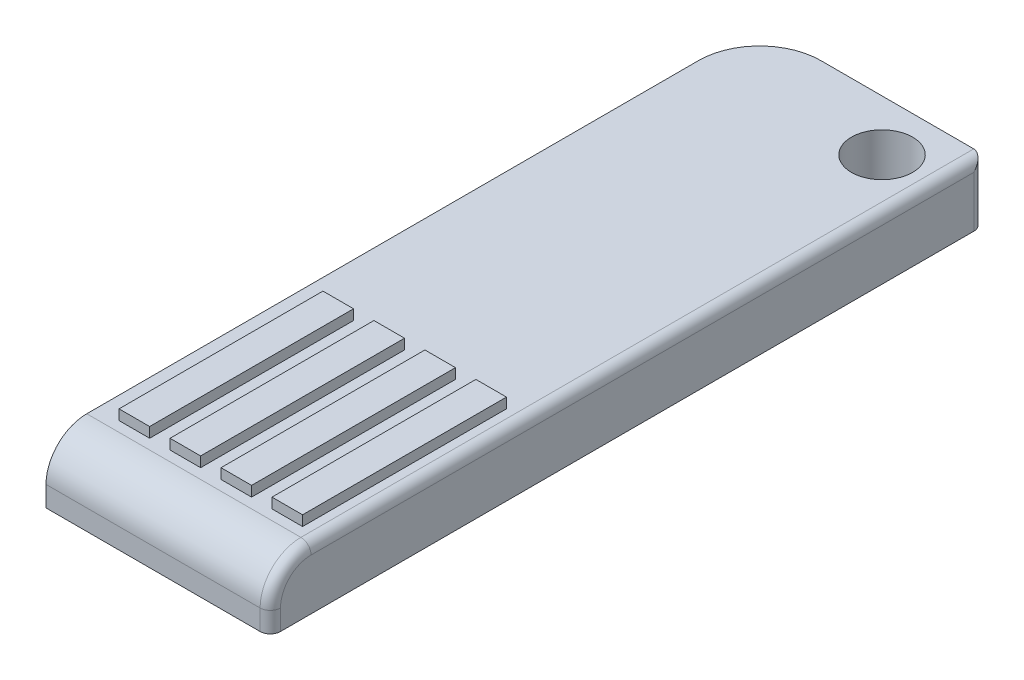
ISO-10303-21;
HEADER;
FILE_DESCRIPTION(('STEP AP214'),'2;1');
FILE_NAME('part.step','',(''),(''),'','','');
FILE_SCHEMA(('AUTOMOTIVE_DESIGN { 1 0 10303 214 1 1 1 1 }'));
ENDSEC;
DATA;
#1=APPLICATION_CONTEXT('core data for automotive mechanical design processes');
#2=APPLICATION_PROTOCOL_DEFINITION('international standard','automotive_design',2000,#1);
#3=PRODUCT_CONTEXT('',#1,'mechanical');
#4=PRODUCT('Part','Part','',(#3));
#5=PRODUCT_RELATED_PRODUCT_CATEGORY('part','',(#4));
#6=PRODUCT_DEFINITION_FORMATION('','',#4);
#7=PRODUCT_DEFINITION_CONTEXT('part definition',#1,'design');
#8=PRODUCT_DEFINITION('design','',#6,#7);
#9=PRODUCT_DEFINITION_SHAPE('','',#8);
#10=(LENGTH_UNIT() NAMED_UNIT(*) SI_UNIT(.MILLI.,.METRE.));
#11=(NAMED_UNIT(*) PLANE_ANGLE_UNIT() SI_UNIT($,.RADIAN.));
#12=(NAMED_UNIT(*) SI_UNIT($,.STERADIAN.) SOLID_ANGLE_UNIT());
#13=UNCERTAINTY_MEASURE_WITH_UNIT(LENGTH_MEASURE(1.E-05),#10,'distance_accuracy_value','');
#14=(GEOMETRIC_REPRESENTATION_CONTEXT(3) GLOBAL_UNCERTAINTY_ASSIGNED_CONTEXT((#13)) GLOBAL_UNIT_ASSIGNED_CONTEXT((#10,
#11,#12)) REPRESENTATION_CONTEXT('',''));
#15=CARTESIAN_POINT('',(0.,0.,0.));
#16=DIRECTION('',(0.,0.,1.));
#17=DIRECTION('',(1.,0.,0.));
#18=AXIS2_PLACEMENT_3D('',#15,#16,#17);
#19=CARTESIAN_POINT('',(0.,3.,0.));
#20=DIRECTION('',(0.,1.,0.));
#21=DIRECTION('',(0.,0.,1.));
#22=AXIS2_PLACEMENT_3D('',#19,#20,#21);
#23=PLANE('',#22);
#24=CARTESIAN_POINT('',(3.0000000000003,3.,-15.0000000000003));
#25=DIRECTION('',(0.,1.,0.));
#26=DIRECTION('',(0.,0.,1.));
#27=AXIS2_PLACEMENT_3D('',#24,#25,#26);
#28=CIRCLE('',#27,1.5);
#29=CARTESIAN_POINT('',(3.0000000000003,3.,-13.5000000000003));
#30=VERTEX_POINT('',#29);
#31=EDGE_CURVE('E318',#30,#30,#28,.T.);
#32=ORIENTED_EDGE('',*,*,#31,.F.);
#33=EDGE_LOOP('',(#32));
#34=FACE_BOUND('',#33,.T.);
#35=DIRECTION('',(1.,0.,0.));
#36=VECTOR('',#35,1.);
#37=CARTESIAN_POINT('',(5.5,3.,15.5));
#38=LINE('',#37,#36);
#39=CARTESIAN_POINT('',(-5.5,3.,15.5));
#40=VERTEX_POINT('',#39);
#41=CARTESIAN_POINT('',(5.,3.,15.5));
#42=VERTEX_POINT('',#41);
#43=EDGE_CURVE('E352',#40,#42,#38,.T.);
#44=ORIENTED_EDGE('',*,*,#43,.T.);
#45=DIRECTION('',(0.,0.,-1.));
#46=VECTOR('',#45,1.);
#47=CARTESIAN_POINT('',(4.99999999999999,3.,-17.5));
#48=LINE('',#47,#46);
#49=CARTESIAN_POINT('',(4.99999999999999,3.,-17.5));
#50=VERTEX_POINT('',#49);
#51=EDGE_CURVE('E359',#42,#50,#48,.T.);
#52=ORIENTED_EDGE('',*,*,#51,.T.);
#53=DIRECTION('',(-1.,0.,0.));
#54=VECTOR('',#53,1.);
#55=CARTESIAN_POINT('',(-5.50000000000001,3.,-17.5));
#56=LINE('',#55,#54);
#57=CARTESIAN_POINT('',(-2.50000000000001,3.,-17.5));
#58=VERTEX_POINT('',#57);
#59=EDGE_CURVE('E325',#50,#58,#56,.T.);
#60=ORIENTED_EDGE('',*,*,#59,.T.);
#61=CARTESIAN_POINT('',(-2.50000000000001,3.,-14.5));
#62=DIRECTION('',(0.,1.,0.));
#63=DIRECTION('',(0.,0.,1.));
#64=AXIS2_PLACEMENT_3D('',#61,#62,#63);
#65=CIRCLE('',#64,3.);
#66=CARTESIAN_POINT('',(-5.50000000000001,3.,-14.5));
#67=VERTEX_POINT('',#66);
#68=EDGE_CURVE('E350',#58,#67,#65,.T.);
#69=ORIENTED_EDGE('',*,*,#68,.T.);
#70=DIRECTION('',(0.,0.,1.));
#71=VECTOR('',#70,1.);
#72=CARTESIAN_POINT('',(-5.50000000000001,3.,-17.5));
#73=LINE('',#72,#71);
#74=EDGE_CURVE('E327',#67,#40,#73,.T.);
#75=ORIENTED_EDGE('',*,*,#74,.T.);
#76=EDGE_LOOP('',(#44,#52,#60,#69,#75));
#77=FACE_BOUND('',#76,.T.);
#78=DIRECTION('',(-1.,0.,0.));
#79=VECTOR('',#78,1.);
#80=CARTESIAN_POINT('',(-4.41748166259169,3.,5.00000000000002));
#81=LINE('',#80,#79);
#82=CARTESIAN_POINT('',(-2.91748166259169,3.,5.00000000000002));
#83=VERTEX_POINT('',#82);
#84=CARTESIAN_POINT('',(-4.41748166259169,3.,5.00000000000002));
#85=VERTEX_POINT('',#84);
#86=EDGE_CURVE('E303',#83,#85,#81,.T.);
#87=ORIENTED_EDGE('',*,*,#86,.F.);
#88=DIRECTION('',(0.,0.,-1.));
#89=VECTOR('',#88,1.);
#90=CARTESIAN_POINT('',(-2.91748166259169,3.,5.00000000000002));
#91=LINE('',#90,#89);
#92=CARTESIAN_POINT('',(-2.91748166259169,3.,15.));
#93=VERTEX_POINT('',#92);
#94=EDGE_CURVE('E289',#93,#83,#91,.T.);
#95=ORIENTED_EDGE('',*,*,#94,.F.);
#96=DIRECTION('',(1.,0.,0.));
#97=VECTOR('',#96,1.);
#98=CARTESIAN_POINT('',(-4.41748166259169,3.,15.));
#99=LINE('',#98,#97);
#100=CARTESIAN_POINT('',(-4.41748166259169,3.,15.));
#101=VERTEX_POINT('',#100);
#102=EDGE_CURVE('E294',#101,#93,#99,.T.);
#103=ORIENTED_EDGE('',*,*,#102,.F.);
#104=DIRECTION('',(0.,0.,1.));
#105=VECTOR('',#104,1.);
#106=CARTESIAN_POINT('',(-4.41748166259169,3.,5.00000000000002));
#107=LINE('',#106,#105);
#108=EDGE_CURVE('E305',#85,#101,#107,.T.);
#109=ORIENTED_EDGE('',*,*,#108,.F.);
#110=EDGE_LOOP('',(#87,#95,#103,#109));
#111=FACE_BOUND('',#110,.T.);
#112=DIRECTION('',(0.,0.,-1.));
#113=VECTOR('',#112,1.);
#114=CARTESIAN_POINT('',(-0.417481662591691,3.,5.00000000000002));
#115=LINE('',#114,#113);
#116=CARTESIAN_POINT('',(-0.41748166259169,3.,15.));
#117=VERTEX_POINT('',#116);
#118=CARTESIAN_POINT('',(-0.417481662591691,3.,5.00000000000002));
#119=VERTEX_POINT('',#118);
#120=EDGE_CURVE('E274',#117,#119,#115,.T.);
#121=ORIENTED_EDGE('',*,*,#120,.F.);
#122=DIRECTION('',(1.,0.,0.));
#123=VECTOR('',#122,1.);
#124=CARTESIAN_POINT('',(-1.91748166259169,3.,15.));
#125=LINE('',#124,#123);
#126=CARTESIAN_POINT('',(-1.91748166259169,3.,15.));
#127=VERTEX_POINT('',#126);
#128=EDGE_CURVE('E260',#127,#117,#125,.T.);
#129=ORIENTED_EDGE('',*,*,#128,.F.);
#130=DIRECTION('',(0.,0.,1.));
#131=VECTOR('',#130,1.);
#132=CARTESIAN_POINT('',(-1.91748166259169,3.,5.00000000000002));
#133=LINE('',#132,#131);
#134=CARTESIAN_POINT('',(-1.91748166259169,3.,5.00000000000002));
#135=VERTEX_POINT('',#134);
#136=EDGE_CURVE('E265',#135,#127,#133,.T.);
#137=ORIENTED_EDGE('',*,*,#136,.F.);
#138=DIRECTION('',(-1.,0.,0.));
#139=VECTOR('',#138,1.);
#140=CARTESIAN_POINT('',(-1.91748166259169,3.,5.00000000000002));
#141=LINE('',#140,#139);
#142=EDGE_CURVE('E276',#119,#135,#141,.T.);
#143=ORIENTED_EDGE('',*,*,#142,.F.);
#144=EDGE_LOOP('',(#121,#129,#137,#143));
#145=FACE_BOUND('',#144,.T.);
#146=DIRECTION('',(0.,0.,-1.));
#147=VECTOR('',#146,1.);
#148=CARTESIAN_POINT('',(2.08251833740831,3.,5.00000000000002));
#149=LINE('',#148,#147);
#150=CARTESIAN_POINT('',(2.08251833740831,3.,15.));
#151=VERTEX_POINT('',#150);
#152=CARTESIAN_POINT('',(2.08251833740831,3.,5.00000000000002));
#153=VERTEX_POINT('',#152);
#154=EDGE_CURVE('E229',#151,#153,#149,.T.);
#155=ORIENTED_EDGE('',*,*,#154,.F.);
#156=DIRECTION('',(1.,0.,0.));
#157=VECTOR('',#156,1.);
#158=CARTESIAN_POINT('',(0.582518337408309,3.,15.));
#159=LINE('',#158,#157);
#160=CARTESIAN_POINT('',(0.582518337408309,3.,15.));
#161=VERTEX_POINT('',#160);
#162=EDGE_CURVE('E226',#161,#151,#159,.T.);
#163=ORIENTED_EDGE('',*,*,#162,.F.);
#164=DIRECTION('',(0.,0.,1.));
#165=VECTOR('',#164,1.);
#166=CARTESIAN_POINT('',(0.582518337408308,3.,5.00000000000002));
#167=LINE('',#166,#165);
#168=CARTESIAN_POINT('',(0.582518337408308,3.,5.00000000000002));
#169=VERTEX_POINT('',#168);
#170=EDGE_CURVE('E239',#169,#161,#167,.T.);
#171=ORIENTED_EDGE('',*,*,#170,.F.);
#172=DIRECTION('',(-1.,0.,0.));
#173=VECTOR('',#172,1.);
#174=CARTESIAN_POINT('',(0.582518337408308,3.,5.00000000000002));
#175=LINE('',#174,#173);
#176=EDGE_CURVE('E247',#153,#169,#175,.T.);
#177=ORIENTED_EDGE('',*,*,#176,.F.);
#178=EDGE_LOOP('',(#155,#163,#171,#177));
#179=FACE_BOUND('',#178,.T.);
#180=DIRECTION('',(0.,0.,-1.));
#181=VECTOR('',#180,1.);
#182=CARTESIAN_POINT('',(4.58251833740831,3.,5.00000000000002));
#183=LINE('',#182,#181);
#184=CARTESIAN_POINT('',(4.58251833740831,3.,15.));
#185=VERTEX_POINT('',#184);
#186=CARTESIAN_POINT('',(4.58251833740831,3.,5.00000000000002));
#187=VERTEX_POINT('',#186);
#188=EDGE_CURVE('E387',#185,#187,#183,.T.);
#189=ORIENTED_EDGE('',*,*,#188,.F.);
#190=DIRECTION('',(1.,0.,0.));
#191=VECTOR('',#190,1.);
#192=CARTESIAN_POINT('',(3.08251833740831,3.,15.));
#193=LINE('',#192,#191);
#194=CARTESIAN_POINT('',(3.08251833740831,3.,15.));
#195=VERTEX_POINT('',#194);
#196=EDGE_CURVE('E224',#195,#185,#193,.T.);
#197=ORIENTED_EDGE('',*,*,#196,.F.);
#198=DIRECTION('',(0.,0.,1.));
#199=VECTOR('',#198,1.);
#200=CARTESIAN_POINT('',(3.08251833740831,3.,5.00000000000002));
#201=LINE('',#200,#199);
#202=CARTESIAN_POINT('',(3.08251833740831,3.,5.00000000000002));
#203=VERTEX_POINT('',#202);
#204=EDGE_CURVE('E220',#203,#195,#201,.T.);
#205=ORIENTED_EDGE('',*,*,#204,.F.);
#206=DIRECTION('',(-1.,0.,0.));
#207=VECTOR('',#206,1.);
#208=CARTESIAN_POINT('',(3.08251833740831,3.,5.00000000000002));
#209=LINE('',#208,#207);
#210=EDGE_CURVE('E389',#187,#203,#209,.T.);
#211=ORIENTED_EDGE('',*,*,#210,.F.);
#212=EDGE_LOOP('',(#189,#197,#205,#211));
#213=FACE_BOUND('',#212,.T.);
#214=ADVANCED_FACE('F33',(#34,#77,#111,#145,#179,#213),#23,.T.);
#215=CARTESIAN_POINT('',(5.49999999999999,3.,-17.5));
#216=DIRECTION('',(-1.,0.,0.));
#217=DIRECTION('',(0.,0.,1.));
#218=AXIS2_PLACEMENT_3D('',#215,#216,#217);
#219=PLANE('',#218);
#220=DIRECTION('',(0.,0.,-1.));
#221=VECTOR('',#220,1.);
#222=CARTESIAN_POINT('',(5.49999999999999,0.,-17.5));
#223=LINE('',#222,#221);
#224=CARTESIAN_POINT('',(5.5,0.,17.));
#225=VERTEX_POINT('',#224);
#226=CARTESIAN_POINT('',(5.49999999999999,0.,-17.));
#227=VERTEX_POINT('',#226);
#228=EDGE_CURVE('E322',#225,#227,#223,.T.);
#229=ORIENTED_EDGE('',*,*,#228,.T.);
#230=DIRECTION('',(0.,-1.,0.));
#231=VECTOR('',#230,1.);
#232=CARTESIAN_POINT('',(5.49999999999999,3.,-17.));
#233=LINE('',#232,#231);
#234=CARTESIAN_POINT('',(5.49999999999999,2.5,-17.));
#235=VERTEX_POINT('',#234);
#236=EDGE_CURVE('E368',#227,#235,#233,.F.);
#237=ORIENTED_EDGE('',*,*,#236,.T.);
#238=DIRECTION('',(0.,0.,-1.));
#239=VECTOR('',#238,1.);
#240=CARTESIAN_POINT('',(5.5,2.5,15.5));
#241=LINE('',#240,#239);
#242=CARTESIAN_POINT('',(5.5,2.5,15.5));
#243=VERTEX_POINT('',#242);
#244=EDGE_CURVE('E366',#235,#243,#241,.F.);
#245=ORIENTED_EDGE('',*,*,#244,.T.);
#246=CARTESIAN_POINT('',(5.5,1.,15.5));
#247=DIRECTION('',(-1.,0.,0.));
#248=DIRECTION('',(0.,0.,1.));
#249=AXIS2_PLACEMENT_3D('',#246,#247,#248);
#250=CIRCLE('',#249,1.5);
#251=CARTESIAN_POINT('',(5.5,1.,17.));
#252=VERTEX_POINT('',#251);
#253=EDGE_CURVE('E364',#243,#252,#250,.F.);
#254=ORIENTED_EDGE('',*,*,#253,.T.);
#255=DIRECTION('',(0.,-1.,0.));
#256=VECTOR('',#255,1.);
#257=CARTESIAN_POINT('',(5.5,3.,17.));
#258=LINE('',#257,#256);
#259=EDGE_CURVE('E362',#252,#225,#258,.T.);
#260=ORIENTED_EDGE('',*,*,#259,.T.);
#261=EDGE_LOOP('',(#229,#237,#245,#254,#260));
#262=FACE_BOUND('',#261,.T.);
#263=ADVANCED_FACE('F407',(#262),#219,.F.);
#264=CARTESIAN_POINT('',(-5.50000000000001,3.,-17.5));
#265=DIRECTION('',(0.,0.,1.));
#266=DIRECTION('',(1.,0.,0.));
#267=AXIS2_PLACEMENT_3D('',#264,#265,#266);
#268=PLANE('',#267);
#269=ORIENTED_EDGE('',*,*,#59,.F.);
#270=DIRECTION('',(0.,-1.,0.));
#271=VECTOR('',#270,1.);
#272=CARTESIAN_POINT('',(4.99999999999999,3.,-17.5));
#273=LINE('',#272,#271);
#274=CARTESIAN_POINT('',(4.99999999999999,0.,-17.5));
#275=VERTEX_POINT('',#274);
#276=EDGE_CURVE('E58',#50,#275,#273,.T.);
#277=ORIENTED_EDGE('',*,*,#276,.T.);
#278=DIRECTION('',(-1.,0.,0.));
#279=VECTOR('',#278,1.);
#280=CARTESIAN_POINT('',(-5.50000000000001,0.,-17.5));
#281=LINE('',#280,#279);
#282=CARTESIAN_POINT('',(-2.50000000000001,0.,-17.5));
#283=VERTEX_POINT('',#282);
#284=EDGE_CURVE('E334',#275,#283,#281,.T.);
#285=ORIENTED_EDGE('',*,*,#284,.T.);
#286=DIRECTION('',(0.,-1.,0.));
#287=VECTOR('',#286,1.);
#288=CARTESIAN_POINT('',(-2.50000000000001,3.,-17.5));
#289=LINE('',#288,#287);
#290=EDGE_CURVE('E347',#283,#58,#289,.F.);
#291=ORIENTED_EDGE('',*,*,#290,.T.);
#292=EDGE_LOOP('',(#269,#277,#285,#291));
#293=FACE_BOUND('',#292,.T.);
#294=ADVANCED_FACE('F414',(#293),#268,.F.);
#295=CARTESIAN_POINT('',(-5.50000000000001,3.,-17.5));
#296=DIRECTION('',(1.,0.,0.));
#297=DIRECTION('',(0.,0.,-1.));
#298=AXIS2_PLACEMENT_3D('',#295,#296,#297);
#299=PLANE('',#298);
#300=DIRECTION('',(0.,-1.,0.));
#301=VECTOR('',#300,1.);
#302=CARTESIAN_POINT('',(-5.5,3.,17.5));
#303=LINE('',#302,#301);
#304=CARTESIAN_POINT('',(-5.5,1.,17.5));
#305=VERTEX_POINT('',#304);
#306=CARTESIAN_POINT('',(-5.5,0.,17.5));
#307=VERTEX_POINT('',#306);
#308=EDGE_CURVE('E331',#305,#307,#303,.T.);
#309=ORIENTED_EDGE('',*,*,#308,.F.);
#310=CARTESIAN_POINT('',(-5.5,1.,15.5));
#311=DIRECTION('',(1.,0.,0.));
#312=DIRECTION('',(0.,0.,-1.));
#313=AXIS2_PLACEMENT_3D('',#310,#311,#312);
#314=CIRCLE('',#313,2.);
#315=EDGE_CURVE('E357',#305,#40,#314,.F.);
#316=ORIENTED_EDGE('',*,*,#315,.T.);
#317=ORIENTED_EDGE('',*,*,#74,.F.);
#318=DIRECTION('',(0.,-1.,0.));
#319=VECTOR('',#318,1.);
#320=CARTESIAN_POINT('',(-5.50000000000001,3.,-14.5));
#321=LINE('',#320,#319);
#322=CARTESIAN_POINT('',(-5.50000000000001,0.,-14.5));
#323=VERTEX_POINT('',#322);
#324=EDGE_CURVE('E341',#67,#323,#321,.T.);
#325=ORIENTED_EDGE('',*,*,#324,.T.);
#326=DIRECTION('',(0.,0.,1.));
#327=VECTOR('',#326,1.);
#328=CARTESIAN_POINT('',(-5.50000000000001,0.,-17.5));
#329=LINE('',#328,#327);
#330=EDGE_CURVE('E336',#323,#307,#329,.T.);
#331=ORIENTED_EDGE('',*,*,#330,.T.);
#332=EDGE_LOOP('',(#309,#316,#317,#325,#331));
#333=FACE_BOUND('',#332,.T.);
#334=ADVANCED_FACE('F430',(#333),#299,.F.);
#335=CARTESIAN_POINT('',(-5.5,3.,17.5));
#336=DIRECTION('',(0.,0.,-1.));
#337=DIRECTION('',(-1.,0.,0.));
#338=AXIS2_PLACEMENT_3D('',#335,#336,#337);
#339=PLANE('',#338);
#340=DIRECTION('',(1.,0.,0.));
#341=VECTOR('',#340,1.);
#342=CARTESIAN_POINT('',(-5.5,0.,17.5));
#343=LINE('',#342,#341);
#344=CARTESIAN_POINT('',(5.,0.,17.5));
#345=VERTEX_POINT('',#344);
#346=EDGE_CURVE('E328',#307,#345,#343,.T.);
#347=ORIENTED_EDGE('',*,*,#346,.T.);
#348=DIRECTION('',(0.,-1.,0.));
#349=VECTOR('',#348,1.);
#350=CARTESIAN_POINT('',(5.,3.,17.5));
#351=LINE('',#350,#349);
#352=CARTESIAN_POINT('',(5.,1.,17.5));
#353=VERTEX_POINT('',#352);
#354=EDGE_CURVE('E11',#345,#353,#351,.F.);
#355=ORIENTED_EDGE('',*,*,#354,.T.);
#356=DIRECTION('',(1.,0.,0.));
#357=VECTOR('',#356,1.);
#358=CARTESIAN_POINT('',(-5.5,1.,17.5));
#359=LINE('',#358,#357);
#360=EDGE_CURVE('E355',#353,#305,#359,.F.);
#361=ORIENTED_EDGE('',*,*,#360,.T.);
#362=ORIENTED_EDGE('',*,*,#308,.T.);
#363=EDGE_LOOP('',(#347,#355,#361,#362));
#364=FACE_BOUND('',#363,.T.);
#365=ADVANCED_FACE('F426',(#364),#339,.F.);
#366=CARTESIAN_POINT('',(0.,0.,0.));
#367=DIRECTION('',(0.,1.,0.));
#368=DIRECTION('',(0.,0.,1.));
#369=AXIS2_PLACEMENT_3D('',#366,#367,#368);
#370=PLANE('',#369);
#371=CARTESIAN_POINT('',(3.0000000000003,0.,-15.0000000000003));
#372=DIRECTION('',(0.,1.,0.));
#373=DIRECTION('',(0.,0.,1.));
#374=AXIS2_PLACEMENT_3D('',#371,#372,#373);
#375=CIRCLE('',#374,1.5);
#376=CARTESIAN_POINT('',(3.0000000000003,0.,-13.5000000000003));
#377=VERTEX_POINT('',#376);
#378=EDGE_CURVE('E319',#377,#377,#375,.T.);
#379=ORIENTED_EDGE('',*,*,#378,.T.);
#380=EDGE_LOOP('',(#379));
#381=FACE_BOUND('',#380,.T.);
#382=ORIENTED_EDGE('',*,*,#284,.F.);
#383=CARTESIAN_POINT('',(4.99999999999999,0.,-17.));
#384=DIRECTION('',(0.,1.,0.));
#385=DIRECTION('',(0.,0.,1.));
#386=AXIS2_PLACEMENT_3D('',#383,#384,#385);
#387=CIRCLE('',#386,0.5);
#388=EDGE_CURVE('E42',#275,#227,#387,.F.);
#389=ORIENTED_EDGE('',*,*,#388,.T.);
#390=ORIENTED_EDGE('',*,*,#228,.F.);
#391=CARTESIAN_POINT('',(5.,0.,17.));
#392=DIRECTION('',(0.,1.,0.));
#393=DIRECTION('',(0.,0.,1.));
#394=AXIS2_PLACEMENT_3D('',#391,#392,#393);
#395=CIRCLE('',#394,0.5);
#396=EDGE_CURVE('E50',#225,#345,#395,.F.);
#397=ORIENTED_EDGE('',*,*,#396,.T.);
#398=ORIENTED_EDGE('',*,*,#346,.F.);
#399=ORIENTED_EDGE('',*,*,#330,.F.);
#400=CARTESIAN_POINT('',(-2.50000000000001,0.,-14.5));
#401=DIRECTION('',(0.,1.,0.));
#402=DIRECTION('',(0.,0.,1.));
#403=AXIS2_PLACEMENT_3D('',#400,#401,#402);
#404=CIRCLE('',#403,3.);
#405=EDGE_CURVE('E344',#323,#283,#404,.F.);
#406=ORIENTED_EDGE('',*,*,#405,.T.);
#407=EDGE_LOOP('',(#382,#389,#390,#397,#398,#399,#406));
#408=FACE_BOUND('',#407,.T.);
#409=ADVANCED_FACE('F423',(#381,#408),#370,.F.);
#410=CARTESIAN_POINT('',(3.0000000000003,0.,-15.0000000000003));
#411=DIRECTION('',(0.,1.,0.));
#412=DIRECTION('',(0.,0.,1.));
#413=AXIS2_PLACEMENT_3D('',#410,#411,#412);
#414=CYLINDRICAL_SURFACE('',#413,1.5);
#415=ORIENTED_EDGE('',*,*,#378,.F.);
#416=EDGE_LOOP('',(#415));
#417=FACE_BOUND('',#416,.T.);
#418=ORIENTED_EDGE('',*,*,#31,.T.);
#419=EDGE_LOOP('',(#418));
#420=FACE_BOUND('',#419,.T.);
#421=ADVANCED_FACE('F421',(#417,#420),#414,.F.);
#422=CARTESIAN_POINT('',(-2.50000000000001,3.,-14.5));
#423=DIRECTION('',(0.,-1.,0.));
#424=DIRECTION('',(0.,0.,-1.));
#425=AXIS2_PLACEMENT_3D('',#422,#423,#424);
#426=CYLINDRICAL_SURFACE('',#425,3.);
#427=ORIENTED_EDGE('',*,*,#68,.F.);
#428=ORIENTED_EDGE('',*,*,#290,.F.);
#429=ORIENTED_EDGE('',*,*,#405,.F.);
#430=ORIENTED_EDGE('',*,*,#324,.F.);
#431=EDGE_LOOP('',(#427,#428,#429,#430));
#432=FACE_BOUND('',#431,.T.);
#433=ADVANCED_FACE('F436',(#432),#426,.T.);
#434=CARTESIAN_POINT('',(-2.91748166259169,3.5,5.00000000000002));
#435=DIRECTION('',(-1.,0.,0.));
#436=DIRECTION('',(0.,0.,1.));
#437=AXIS2_PLACEMENT_3D('',#434,#435,#436);
#438=PLANE('',#437);
#439=ORIENTED_EDGE('',*,*,#94,.T.);
#440=DIRECTION('',(0.,-1.,0.));
#441=VECTOR('',#440,1.);
#442=CARTESIAN_POINT('',(-2.91748166259169,3.5,5.00000000000002));
#443=LINE('',#442,#441);
#444=CARTESIAN_POINT('',(-2.91748166259169,3.5,5.00000000000002));
#445=VERTEX_POINT('',#444);
#446=EDGE_CURVE('E316',#445,#83,#443,.T.);
#447=ORIENTED_EDGE('',*,*,#446,.F.);
#448=DIRECTION('',(0.,0.,-1.));
#449=VECTOR('',#448,1.);
#450=CARTESIAN_POINT('',(-2.91748166259169,3.5,5.00000000000002));
#451=LINE('',#450,#449);
#452=CARTESIAN_POINT('',(-2.91748166259169,3.5,15.));
#453=VERTEX_POINT('',#452);
#454=EDGE_CURVE('E290',#453,#445,#451,.T.);
#455=ORIENTED_EDGE('',*,*,#454,.F.);
#456=DIRECTION('',(0.,-1.,0.));
#457=VECTOR('',#456,1.);
#458=CARTESIAN_POINT('',(-2.91748166259169,3.5,15.));
#459=LINE('',#458,#457);
#460=EDGE_CURVE('E300',#453,#93,#459,.T.);
#461=ORIENTED_EDGE('',*,*,#460,.T.);
#462=EDGE_LOOP('',(#439,#447,#455,#461));
#463=FACE_BOUND('',#462,.T.);
#464=ADVANCED_FACE('F439',(#463),#438,.F.);
#465=CARTESIAN_POINT('',(-4.41748166259169,3.5,5.00000000000002));
#466=DIRECTION('',(0.,0.,1.));
#467=DIRECTION('',(1.,0.,0.));
#468=AXIS2_PLACEMENT_3D('',#465,#466,#467);
#469=PLANE('',#468);
#470=ORIENTED_EDGE('',*,*,#86,.T.);
#471=DIRECTION('',(0.,-1.,0.));
#472=VECTOR('',#471,1.);
#473=CARTESIAN_POINT('',(-4.41748166259169,3.5,5.00000000000002));
#474=LINE('',#473,#472);
#475=CARTESIAN_POINT('',(-4.41748166259169,3.5,5.00000000000002));
#476=VERTEX_POINT('',#475);
#477=EDGE_CURVE('E313',#476,#85,#474,.T.);
#478=ORIENTED_EDGE('',*,*,#477,.F.);
#479=DIRECTION('',(-1.,0.,0.));
#480=VECTOR('',#479,1.);
#481=CARTESIAN_POINT('',(-4.41748166259169,3.5,5.00000000000002));
#482=LINE('',#481,#480);
#483=EDGE_CURVE('E293',#445,#476,#482,.T.);
#484=ORIENTED_EDGE('',*,*,#483,.F.);
#485=ORIENTED_EDGE('',*,*,#446,.T.);
#486=EDGE_LOOP('',(#470,#478,#484,#485));
#487=FACE_BOUND('',#486,.T.);
#488=ADVANCED_FACE('F548',(#487),#469,.F.);
#489=CARTESIAN_POINT('',(-4.41748166259169,3.5,5.00000000000002));
#490=DIRECTION('',(1.,0.,0.));
#491=DIRECTION('',(0.,0.,-1.));
#492=AXIS2_PLACEMENT_3D('',#489,#490,#491);
#493=PLANE('',#492);
#494=ORIENTED_EDGE('',*,*,#108,.T.);
#495=DIRECTION('',(0.,-1.,0.));
#496=VECTOR('',#495,1.);
#497=CARTESIAN_POINT('',(-4.41748166259169,3.5,15.));
#498=LINE('',#497,#496);
#499=CARTESIAN_POINT('',(-4.41748166259169,3.5,15.));
#500=VERTEX_POINT('',#499);
#501=EDGE_CURVE('E311',#500,#101,#498,.T.);
#502=ORIENTED_EDGE('',*,*,#501,.F.);
#503=DIRECTION('',(0.,0.,1.));
#504=VECTOR('',#503,1.);
#505=CARTESIAN_POINT('',(-4.41748166259169,3.5,5.00000000000002));
#506=LINE('',#505,#504);
#507=EDGE_CURVE('E296',#476,#500,#506,.T.);
#508=ORIENTED_EDGE('',*,*,#507,.F.);
#509=ORIENTED_EDGE('',*,*,#477,.T.);
#510=EDGE_LOOP('',(#494,#502,#508,#509));
#511=FACE_BOUND('',#510,.T.);
#512=ADVANCED_FACE('F544',(#511),#493,.F.);
#513=CARTESIAN_POINT('',(-4.41748166259169,3.5,15.));
#514=DIRECTION('',(0.,0.,-1.));
#515=DIRECTION('',(-1.,0.,0.));
#516=AXIS2_PLACEMENT_3D('',#513,#514,#515);
#517=PLANE('',#516);
#518=ORIENTED_EDGE('',*,*,#102,.T.);
#519=ORIENTED_EDGE('',*,*,#460,.F.);
#520=DIRECTION('',(1.,0.,0.));
#521=VECTOR('',#520,1.);
#522=CARTESIAN_POINT('',(-4.41748166259169,3.5,15.));
#523=LINE('',#522,#521);
#524=EDGE_CURVE('E298',#500,#453,#523,.T.);
#525=ORIENTED_EDGE('',*,*,#524,.F.);
#526=ORIENTED_EDGE('',*,*,#501,.T.);
#527=EDGE_LOOP('',(#518,#519,#525,#526));
#528=FACE_BOUND('',#527,.T.);
#529=ADVANCED_FACE('F540',(#528),#517,.F.);
#530=CARTESIAN_POINT('',(0.,3.5,0.));
#531=DIRECTION('',(0.,1.,0.));
#532=DIRECTION('',(0.,0.,1.));
#533=AXIS2_PLACEMENT_3D('',#530,#531,#532);
#534=PLANE('',#533);
#535=ORIENTED_EDGE('',*,*,#454,.T.);
#536=ORIENTED_EDGE('',*,*,#483,.T.);
#537=ORIENTED_EDGE('',*,*,#507,.T.);
#538=ORIENTED_EDGE('',*,*,#524,.T.);
#539=EDGE_LOOP('',(#535,#536,#537,#538));
#540=FACE_BOUND('',#539,.T.);
#541=ADVANCED_FACE('F536',(#540),#534,.T.);
#542=CARTESIAN_POINT('',(-1.91748166259169,3.5,15.));
#543=DIRECTION('',(0.,0.,-1.));
#544=DIRECTION('',(-1.,0.,0.));
#545=AXIS2_PLACEMENT_3D('',#542,#543,#544);
#546=PLANE('',#545);
#547=ORIENTED_EDGE('',*,*,#128,.T.);
#548=DIRECTION('',(0.,-1.,0.));
#549=VECTOR('',#548,1.);
#550=CARTESIAN_POINT('',(-0.41748166259169,3.5,15.));
#551=LINE('',#550,#549);
#552=CARTESIAN_POINT('',(-0.41748166259169,3.5,15.));
#553=VERTEX_POINT('',#552);
#554=EDGE_CURVE('E287',#553,#117,#551,.T.);
#555=ORIENTED_EDGE('',*,*,#554,.F.);
#556=DIRECTION('',(1.,0.,0.));
#557=VECTOR('',#556,1.);
#558=CARTESIAN_POINT('',(-1.91748166259169,3.5,15.));
#559=LINE('',#558,#557);
#560=CARTESIAN_POINT('',(-1.91748166259169,3.5,15.));
#561=VERTEX_POINT('',#560);
#562=EDGE_CURVE('E261',#561,#553,#559,.T.);
#563=ORIENTED_EDGE('',*,*,#562,.F.);
#564=DIRECTION('',(0.,-1.,0.));
#565=VECTOR('',#564,1.);
#566=CARTESIAN_POINT('',(-1.91748166259169,3.5,15.));
#567=LINE('',#566,#565);
#568=EDGE_CURVE('E271',#561,#127,#567,.T.);
#569=ORIENTED_EDGE('',*,*,#568,.T.);
#570=EDGE_LOOP('',(#547,#555,#563,#569));
#571=FACE_BOUND('',#570,.T.);
#572=ADVANCED_FACE('F532',(#571),#546,.F.);
#573=CARTESIAN_POINT('',(-0.417481662591691,3.5,5.00000000000002));
#574=DIRECTION('',(-1.,0.,0.));
#575=DIRECTION('',(0.,0.,1.));
#576=AXIS2_PLACEMENT_3D('',#573,#574,#575);
#577=PLANE('',#576);
#578=ORIENTED_EDGE('',*,*,#120,.T.);
#579=DIRECTION('',(0.,-1.,0.));
#580=VECTOR('',#579,1.);
#581=CARTESIAN_POINT('',(-0.417481662591691,3.5,5.00000000000002));
#582=LINE('',#581,#580);
#583=CARTESIAN_POINT('',(-0.417481662591691,3.5,5.00000000000002));
#584=VERTEX_POINT('',#583);
#585=EDGE_CURVE('E284',#584,#119,#582,.T.);
#586=ORIENTED_EDGE('',*,*,#585,.F.);
#587=DIRECTION('',(0.,0.,-1.));
#588=VECTOR('',#587,1.);
#589=CARTESIAN_POINT('',(-0.417481662591691,3.5,5.00000000000002));
#590=LINE('',#589,#588);
#591=EDGE_CURVE('E264',#553,#584,#590,.T.);
#592=ORIENTED_EDGE('',*,*,#591,.F.);
#593=ORIENTED_EDGE('',*,*,#554,.T.);
#594=EDGE_LOOP('',(#578,#586,#592,#593));
#595=FACE_BOUND('',#594,.T.);
#596=ADVANCED_FACE('F528',(#595),#577,.F.);
#597=CARTESIAN_POINT('',(-1.91748166259169,3.5,5.00000000000002));
#598=DIRECTION('',(0.,0.,1.));
#599=DIRECTION('',(1.,0.,0.));
#600=AXIS2_PLACEMENT_3D('',#597,#598,#599);
#601=PLANE('',#600);
#602=ORIENTED_EDGE('',*,*,#142,.T.);
#603=DIRECTION('',(0.,-1.,0.));
#604=VECTOR('',#603,1.);
#605=CARTESIAN_POINT('',(-1.91748166259169,3.5,5.00000000000002));
#606=LINE('',#605,#604);
#607=CARTESIAN_POINT('',(-1.91748166259169,3.5,5.00000000000002));
#608=VERTEX_POINT('',#607);
#609=EDGE_CURVE('E282',#608,#135,#606,.T.);
#610=ORIENTED_EDGE('',*,*,#609,.F.);
#611=DIRECTION('',(-1.,0.,0.));
#612=VECTOR('',#611,1.);
#613=CARTESIAN_POINT('',(-1.91748166259169,3.5,5.00000000000002));
#614=LINE('',#613,#612);
#615=EDGE_CURVE('E267',#584,#608,#614,.T.);
#616=ORIENTED_EDGE('',*,*,#615,.F.);
#617=ORIENTED_EDGE('',*,*,#585,.T.);
#618=EDGE_LOOP('',(#602,#610,#616,#617));
#619=FACE_BOUND('',#618,.T.);
#620=ADVANCED_FACE('F524',(#619),#601,.F.);
#621=CARTESIAN_POINT('',(-1.91748166259169,3.5,5.00000000000002));
#622=DIRECTION('',(1.,0.,0.));
#623=DIRECTION('',(0.,0.,-1.));
#624=AXIS2_PLACEMENT_3D('',#621,#622,#623);
#625=PLANE('',#624);
#626=ORIENTED_EDGE('',*,*,#136,.T.);
#627=ORIENTED_EDGE('',*,*,#568,.F.);
#628=DIRECTION('',(0.,0.,1.));
#629=VECTOR('',#628,1.);
#630=CARTESIAN_POINT('',(-1.91748166259169,3.5,5.00000000000002));
#631=LINE('',#630,#629);
#632=EDGE_CURVE('E269',#608,#561,#631,.T.);
#633=ORIENTED_EDGE('',*,*,#632,.F.);
#634=ORIENTED_EDGE('',*,*,#609,.T.);
#635=EDGE_LOOP('',(#626,#627,#633,#634));
#636=FACE_BOUND('',#635,.T.);
#637=ADVANCED_FACE('F520',(#636),#625,.F.);
#638=CARTESIAN_POINT('',(0.,3.5,0.));
#639=DIRECTION('',(0.,-1.,0.));
#640=DIRECTION('',(0.,0.,-1.));
#641=AXIS2_PLACEMENT_3D('',#638,#639,#640);
#642=PLANE('',#641);
#643=ORIENTED_EDGE('',*,*,#562,.T.);
#644=ORIENTED_EDGE('',*,*,#591,.T.);
#645=ORIENTED_EDGE('',*,*,#615,.T.);
#646=ORIENTED_EDGE('',*,*,#632,.T.);
#647=EDGE_LOOP('',(#643,#644,#645,#646));
#648=FACE_BOUND('',#647,.T.);
#649=ADVANCED_FACE('F517',(#648),#642,.F.);
#650=CARTESIAN_POINT('',(0.582518337408309,3.5,15.));
#651=DIRECTION('',(0.,0.,-1.));
#652=DIRECTION('',(-1.,0.,0.));
#653=AXIS2_PLACEMENT_3D('',#650,#651,#652);
#654=PLANE('',#653);
#655=ORIENTED_EDGE('',*,*,#162,.T.);
#656=DIRECTION('',(0.,-1.,0.));
#657=VECTOR('',#656,1.);
#658=CARTESIAN_POINT('',(2.08251833740831,3.5,15.));
#659=LINE('',#658,#657);
#660=CARTESIAN_POINT('',(2.08251833740831,3.5,15.));
#661=VERTEX_POINT('',#660);
#662=EDGE_CURVE('E258',#661,#151,#659,.T.);
#663=ORIENTED_EDGE('',*,*,#662,.F.);
#664=DIRECTION('',(1.,0.,0.));
#665=VECTOR('',#664,1.);
#666=CARTESIAN_POINT('',(0.582518337408309,3.5,15.));
#667=LINE('',#666,#665);
#668=CARTESIAN_POINT('',(0.582518337408309,3.5,15.));
#669=VERTEX_POINT('',#668);
#670=EDGE_CURVE('E235',#669,#661,#667,.T.);
#671=ORIENTED_EDGE('',*,*,#670,.F.);
#672=DIRECTION('',(0.,-1.,0.));
#673=VECTOR('',#672,1.);
#674=CARTESIAN_POINT('',(0.582518337408309,3.5,15.));
#675=LINE('',#674,#673);
#676=EDGE_CURVE('E244',#669,#161,#675,.T.);
#677=ORIENTED_EDGE('',*,*,#676,.T.);
#678=EDGE_LOOP('',(#655,#663,#671,#677));
#679=FACE_BOUND('',#678,.T.);
#680=ADVANCED_FACE('F500',(#679),#654,.F.);
#681=CARTESIAN_POINT('',(2.08251833740831,3.5,5.00000000000002));
#682=DIRECTION('',(-1.,0.,0.));
#683=DIRECTION('',(0.,0.,1.));
#684=AXIS2_PLACEMENT_3D('',#681,#682,#683);
#685=PLANE('',#684);
#686=ORIENTED_EDGE('',*,*,#154,.T.);
#687=DIRECTION('',(0.,-1.,0.));
#688=VECTOR('',#687,1.);
#689=CARTESIAN_POINT('',(2.08251833740831,3.5,5.00000000000002));
#690=LINE('',#689,#688);
#691=CARTESIAN_POINT('',(2.08251833740831,3.5,5.00000000000002));
#692=VERTEX_POINT('',#691);
#693=EDGE_CURVE('E255',#692,#153,#690,.T.);
#694=ORIENTED_EDGE('',*,*,#693,.F.);
#695=DIRECTION('',(0.,0.,-1.));
#696=VECTOR('',#695,1.);
#697=CARTESIAN_POINT('',(2.08251833740831,3.5,5.00000000000002));
#698=LINE('',#697,#696);
#699=EDGE_CURVE('E238',#661,#692,#698,.T.);
#700=ORIENTED_EDGE('',*,*,#699,.F.);
#701=ORIENTED_EDGE('',*,*,#662,.T.);
#702=EDGE_LOOP('',(#686,#694,#700,#701));
#703=FACE_BOUND('',#702,.T.);
#704=ADVANCED_FACE('F488',(#703),#685,.F.);
#705=CARTESIAN_POINT('',(0.582518337408308,3.5,5.00000000000002));
#706=DIRECTION('',(0.,0.,1.));
#707=DIRECTION('',(1.,0.,0.));
#708=AXIS2_PLACEMENT_3D('',#705,#706,#707);
#709=PLANE('',#708);
#710=ORIENTED_EDGE('',*,*,#176,.T.);
#711=DIRECTION('',(0.,-1.,0.));
#712=VECTOR('',#711,1.);
#713=CARTESIAN_POINT('',(0.582518337408308,3.5,5.00000000000002));
#714=LINE('',#713,#712);
#715=CARTESIAN_POINT('',(0.582518337408308,3.5,5.00000000000002));
#716=VERTEX_POINT('',#715);
#717=EDGE_CURVE('E253',#716,#169,#714,.T.);
#718=ORIENTED_EDGE('',*,*,#717,.F.);
#719=DIRECTION('',(-1.,0.,0.));
#720=VECTOR('',#719,1.);
#721=CARTESIAN_POINT('',(0.582518337408308,3.5,5.00000000000002));
#722=LINE('',#721,#720);
#723=EDGE_CURVE('E241',#692,#716,#722,.T.);
#724=ORIENTED_EDGE('',*,*,#723,.F.);
#725=ORIENTED_EDGE('',*,*,#693,.T.);
#726=EDGE_LOOP('',(#710,#718,#724,#725));
#727=FACE_BOUND('',#726,.T.);
#728=ADVANCED_FACE('F492',(#727),#709,.F.);
#729=CARTESIAN_POINT('',(0.582518337408308,3.5,5.00000000000002));
#730=DIRECTION('',(1.,0.,0.));
#731=DIRECTION('',(0.,0.,-1.));
#732=AXIS2_PLACEMENT_3D('',#729,#730,#731);
#733=PLANE('',#732);
#734=ORIENTED_EDGE('',*,*,#170,.T.);
#735=ORIENTED_EDGE('',*,*,#676,.F.);
#736=DIRECTION('',(0.,0.,1.));
#737=VECTOR('',#736,1.);
#738=CARTESIAN_POINT('',(0.582518337408308,3.5,5.00000000000002));
#739=LINE('',#738,#737);
#740=EDGE_CURVE('E243',#716,#669,#739,.T.);
#741=ORIENTED_EDGE('',*,*,#740,.F.);
#742=ORIENTED_EDGE('',*,*,#717,.T.);
#743=EDGE_LOOP('',(#734,#735,#741,#742));
#744=FACE_BOUND('',#743,.T.);
#745=ADVANCED_FACE('F502',(#744),#733,.F.);
#746=CARTESIAN_POINT('',(0.,3.5,0.));
#747=DIRECTION('',(0.,-1.,0.));
#748=DIRECTION('',(0.,0.,-1.));
#749=AXIS2_PLACEMENT_3D('',#746,#747,#748);
#750=PLANE('',#749);
#751=ORIENTED_EDGE('',*,*,#670,.T.);
#752=ORIENTED_EDGE('',*,*,#699,.T.);
#753=ORIENTED_EDGE('',*,*,#723,.T.);
#754=ORIENTED_EDGE('',*,*,#740,.T.);
#755=EDGE_LOOP('',(#751,#752,#753,#754));
#756=FACE_BOUND('',#755,.T.);
#757=ADVANCED_FACE('F496',(#756),#750,.F.);
#758=CARTESIAN_POINT('',(3.08251833740831,3.5,15.));
#759=DIRECTION('',(0.,0.,-1.));
#760=DIRECTION('',(-1.,0.,0.));
#761=AXIS2_PLACEMENT_3D('',#758,#759,#760);
#762=PLANE('',#761);
#763=ORIENTED_EDGE('',*,*,#196,.T.);
#764=DIRECTION('',(0.,-1.,0.));
#765=VECTOR('',#764,1.);
#766=CARTESIAN_POINT('',(4.58251833740831,3.5,15.));
#767=LINE('',#766,#765);
#768=CARTESIAN_POINT('',(4.58251833740831,3.5,15.));
#769=VERTEX_POINT('',#768);
#770=EDGE_CURVE('E204',#769,#185,#767,.T.);
#771=ORIENTED_EDGE('',*,*,#770,.F.);
#772=DIRECTION('',(1.,0.,0.));
#773=VECTOR('',#772,1.);
#774=CARTESIAN_POINT('',(3.08251833740831,3.5,15.));
#775=LINE('',#774,#773);
#776=CARTESIAN_POINT('',(3.08251833740831,3.5,15.));
#777=VERTEX_POINT('',#776);
#778=EDGE_CURVE('E211',#777,#769,#775,.T.);
#779=ORIENTED_EDGE('',*,*,#778,.F.);
#780=DIRECTION('',(0.,-1.,0.));
#781=VECTOR('',#780,1.);
#782=CARTESIAN_POINT('',(3.08251833740831,3.5,15.));
#783=LINE('',#782,#781);
#784=EDGE_CURVE('E397',#777,#195,#783,.T.);
#785=ORIENTED_EDGE('',*,*,#784,.T.);
#786=EDGE_LOOP('',(#763,#771,#779,#785));
#787=FACE_BOUND('',#786,.T.);
#788=ADVANCED_FACE('F222',(#787),#762,.F.);
#789=CARTESIAN_POINT('',(4.58251833740831,3.5,5.00000000000002));
#790=DIRECTION('',(-1.,0.,0.));
#791=DIRECTION('',(0.,0.,1.));
#792=AXIS2_PLACEMENT_3D('',#789,#790,#791);
#793=PLANE('',#792);
#794=ORIENTED_EDGE('',*,*,#188,.T.);
#795=DIRECTION('',(0.,-1.,0.));
#796=VECTOR('',#795,1.);
#797=CARTESIAN_POINT('',(4.58251833740831,3.5,5.00000000000002));
#798=LINE('',#797,#796);
#799=CARTESIAN_POINT('',(4.58251833740831,3.5,5.00000000000002));
#800=VERTEX_POINT('',#799);
#801=EDGE_CURVE('E207',#800,#187,#798,.T.);
#802=ORIENTED_EDGE('',*,*,#801,.F.);
#803=DIRECTION('',(0.,0.,-1.));
#804=VECTOR('',#803,1.);
#805=CARTESIAN_POINT('',(4.58251833740831,3.5,5.00000000000002));
#806=LINE('',#805,#804);
#807=EDGE_CURVE('E200',#769,#800,#806,.T.);
#808=ORIENTED_EDGE('',*,*,#807,.F.);
#809=ORIENTED_EDGE('',*,*,#770,.T.);
#810=EDGE_LOOP('',(#794,#802,#808,#809));
#811=FACE_BOUND('',#810,.T.);
#812=ADVANCED_FACE('F202',(#811),#793,.F.);
#813=CARTESIAN_POINT('',(3.08251833740831,3.5,5.00000000000002));
#814=DIRECTION('',(0.,0.,1.));
#815=DIRECTION('',(1.,0.,0.));
#816=AXIS2_PLACEMENT_3D('',#813,#814,#815);
#817=PLANE('',#816);
#818=ORIENTED_EDGE('',*,*,#210,.T.);
#819=DIRECTION('',(0.,-1.,0.));
#820=VECTOR('',#819,1.);
#821=CARTESIAN_POINT('',(3.08251833740831,3.5,5.00000000000002));
#822=LINE('',#821,#820);
#823=CARTESIAN_POINT('',(3.08251833740831,3.5,5.00000000000002));
#824=VERTEX_POINT('',#823);
#825=EDGE_CURVE('E231',#824,#203,#822,.T.);
#826=ORIENTED_EDGE('',*,*,#825,.F.);
#827=DIRECTION('',(-1.,0.,0.));
#828=VECTOR('',#827,1.);
#829=CARTESIAN_POINT('',(3.08251833740831,3.5,5.00000000000002));
#830=LINE('',#829,#828);
#831=EDGE_CURVE('E210',#800,#824,#830,.T.);
#832=ORIENTED_EDGE('',*,*,#831,.F.);
#833=ORIENTED_EDGE('',*,*,#801,.T.);
#834=EDGE_LOOP('',(#818,#826,#832,#833));
#835=FACE_BOUND('',#834,.T.);
#836=ADVANCED_FACE('F404',(#835),#817,.F.);
#837=CARTESIAN_POINT('',(3.08251833740831,3.5,5.00000000000002));
#838=DIRECTION('',(1.,0.,0.));
#839=DIRECTION('',(0.,0.,-1.));
#840=AXIS2_PLACEMENT_3D('',#837,#838,#839);
#841=PLANE('',#840);
#842=ORIENTED_EDGE('',*,*,#204,.T.);
#843=ORIENTED_EDGE('',*,*,#784,.F.);
#844=DIRECTION('',(0.,0.,1.));
#845=VECTOR('',#844,1.);
#846=CARTESIAN_POINT('',(3.08251833740831,3.5,5.00000000000002));
#847=LINE('',#846,#845);
#848=EDGE_CURVE('E216',#824,#777,#847,.T.);
#849=ORIENTED_EDGE('',*,*,#848,.F.);
#850=ORIENTED_EDGE('',*,*,#825,.T.);
#851=EDGE_LOOP('',(#842,#843,#849,#850));
#852=FACE_BOUND('',#851,.T.);
#853=ADVANCED_FACE('F400',(#852),#841,.F.);
#854=CARTESIAN_POINT('',(0.,3.5,0.));
#855=DIRECTION('',(0.,-1.,0.));
#856=DIRECTION('',(0.,0.,-1.));
#857=AXIS2_PLACEMENT_3D('',#854,#855,#856);
#858=PLANE('',#857);
#859=ORIENTED_EDGE('',*,*,#778,.T.);
#860=ORIENTED_EDGE('',*,*,#807,.T.);
#861=ORIENTED_EDGE('',*,*,#831,.T.);
#862=ORIENTED_EDGE('',*,*,#848,.T.);
#863=EDGE_LOOP('',(#859,#860,#861,#862));
#864=FACE_BOUND('',#863,.T.);
#865=ADVANCED_FACE('F214',(#864),#858,.F.);
#866=CARTESIAN_POINT('',(0.,1.,15.5));
#867=DIRECTION('',(-1.,0.,0.));
#868=DIRECTION('',(0.,0.,1.));
#869=AXIS2_PLACEMENT_3D('',#866,#867,#868);
#870=CYLINDRICAL_SURFACE('',#869,2.);
#871=ORIENTED_EDGE('',*,*,#360,.F.);
#872=CARTESIAN_POINT('',(5.,1.,15.5));
#873=DIRECTION('',(-1.,0.,0.));
#874=DIRECTION('',(0.,0.,1.));
#875=AXIS2_PLACEMENT_3D('',#872,#873,#874);
#876=CIRCLE('',#875,2.);
#877=EDGE_CURVE('E370',#353,#42,#876,.T.);
#878=ORIENTED_EDGE('',*,*,#877,.T.);
#879=ORIENTED_EDGE('',*,*,#43,.F.);
#880=ORIENTED_EDGE('',*,*,#315,.F.);
#881=EDGE_LOOP('',(#871,#878,#879,#880));
#882=FACE_BOUND('',#881,.T.);
#883=ADVANCED_FACE('F441',(#882),#870,.T.);
#884=CARTESIAN_POINT('',(5.,3.,17.));
#885=DIRECTION('',(0.,-1.,0.));
#886=DIRECTION('',(0.,0.,-1.));
#887=AXIS2_PLACEMENT_3D('',#884,#885,#886);
#888=CYLINDRICAL_SURFACE('',#887,0.5);
#889=ORIENTED_EDGE('',*,*,#396,.F.);
#890=ORIENTED_EDGE('',*,*,#259,.F.);
#891=CARTESIAN_POINT('',(5.,1.,17.));
#892=DIRECTION('',(0.,1.,0.));
#893=DIRECTION('',(0.,0.,1.));
#894=AXIS2_PLACEMENT_3D('',#891,#892,#893);
#895=CIRCLE('',#894,0.5);
#896=EDGE_CURVE('E37',#353,#252,#895,.T.);
#897=ORIENTED_EDGE('',*,*,#896,.F.);
#898=ORIENTED_EDGE('',*,*,#354,.F.);
#899=EDGE_LOOP('',(#889,#890,#897,#898));
#900=FACE_BOUND('',#899,.T.);
#901=ADVANCED_FACE('F35',(#900),#888,.T.);
#902=CARTESIAN_POINT('',(5.,1.,15.5));
#903=DIRECTION('',(-1.,0.,0.));
#904=DIRECTION('',(0.,0.,1.));
#905=AXIS2_PLACEMENT_3D('',#902,#903,#904);
#906=TOROIDAL_SURFACE('',#905,1.5,0.5);
#907=ORIENTED_EDGE('',*,*,#896,.T.);
#908=ORIENTED_EDGE('',*,*,#253,.F.);
#909=CARTESIAN_POINT('',(5.,2.5,15.5));
#910=DIRECTION('',(0.,0.,-1.));
#911=DIRECTION('',(-1.,0.,0.));
#912=AXIS2_PLACEMENT_3D('',#909,#910,#911);
#913=CIRCLE('',#912,0.5);
#914=EDGE_CURVE('E376',#42,#243,#913,.T.);
#915=ORIENTED_EDGE('',*,*,#914,.F.);
#916=ORIENTED_EDGE('',*,*,#877,.F.);
#917=EDGE_LOOP('',(#907,#908,#915,#916));
#918=FACE_BOUND('',#917,.T.);
#919=ADVANCED_FACE('F450',(#918),#906,.T.);
#920=CARTESIAN_POINT('',(4.99999999999999,3.,-17.));
#921=DIRECTION('',(0.,-1.,0.));
#922=DIRECTION('',(0.,0.,-1.));
#923=AXIS2_PLACEMENT_3D('',#920,#921,#922);
#924=CYLINDRICAL_SURFACE('',#923,0.5);
#925=ORIENTED_EDGE('',*,*,#388,.F.);
#926=ORIENTED_EDGE('',*,*,#276,.F.);
#927=CARTESIAN_POINT('',(4.99999999999999,2.5,-17.));
#928=DIRECTION('',(0.,-0.707106781186547,-0.707106781186547));
#929=DIRECTION('',(0.,-0.707106781186547,0.707106781186547));
#930=AXIS2_PLACEMENT_3D('',#927,#928,#929);
#931=ELLIPSE('',#930,0.707106781186547,0.5);
#932=EDGE_CURVE('E375',#235,#50,#931,.F.);
#933=ORIENTED_EDGE('',*,*,#932,.F.);
#934=ORIENTED_EDGE('',*,*,#236,.F.);
#935=EDGE_LOOP('',(#925,#926,#933,#934));
#936=FACE_BOUND('',#935,.T.);
#937=ADVANCED_FACE('F448',(#936),#924,.T.);
#938=CARTESIAN_POINT('',(4.99999999999999,2.5,0.));
#939=DIRECTION('',(0.,0.,1.));
#940=DIRECTION('',(1.,0.,0.));
#941=AXIS2_PLACEMENT_3D('',#938,#939,#940);
#942=CYLINDRICAL_SURFACE('',#941,0.5);
#943=ORIENTED_EDGE('',*,*,#914,.T.);
#944=ORIENTED_EDGE('',*,*,#244,.F.);
#945=ORIENTED_EDGE('',*,*,#932,.T.);
#946=ORIENTED_EDGE('',*,*,#51,.F.);
#947=EDGE_LOOP('',(#943,#944,#945,#946));
#948=FACE_BOUND('',#947,.T.);
#949=ADVANCED_FACE('F445',(#948),#942,.T.);
#950=CLOSED_SHELL('',(#214,#263,#294,#334,#365,#409,#421,#433,#464,#488,#512,#529,#541,#572,
#596,#620,#637,#649,#680,#704,#728,#745,#757,#788,#812,#836,#853,#865,#883,#901,#919,#937,#949));
#951=MANIFOLD_SOLID_BREP('B2',#950);
#952=ADVANCED_BREP_SHAPE_REPRESENTATION('',(#18,#951),#14);
#953=SHAPE_DEFINITION_REPRESENTATION(#9,#952);
ENDSEC;
END-ISO-10303-21;
